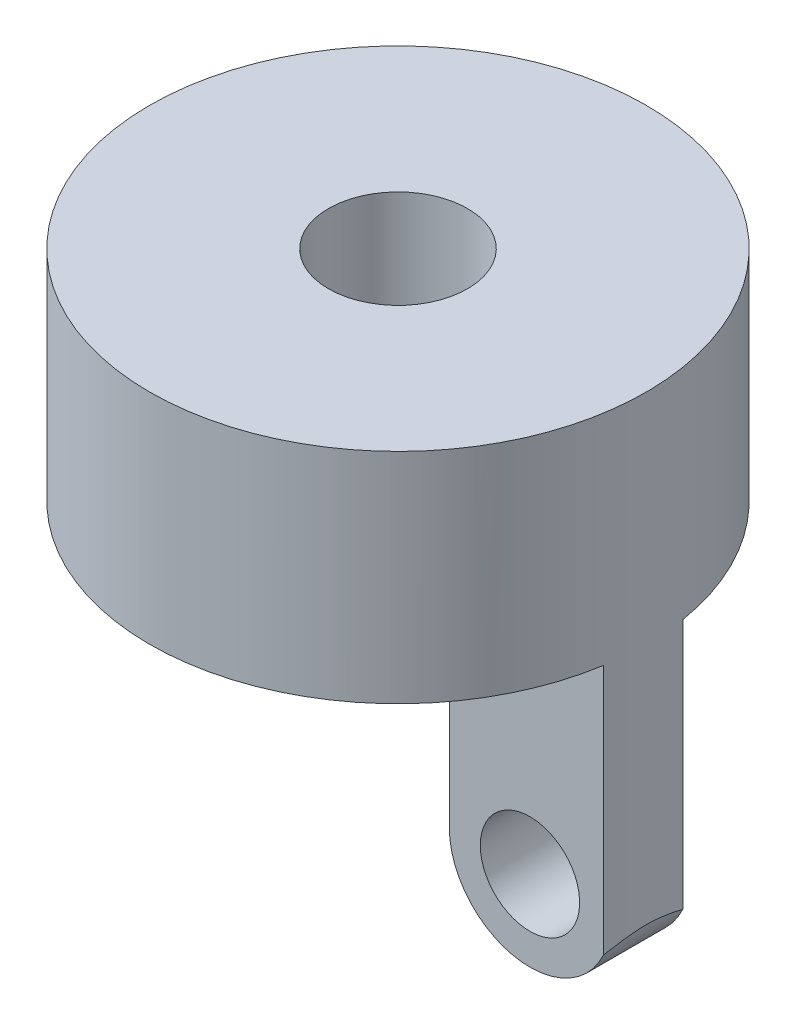
ISO-10303-21;
HEADER;
FILE_DESCRIPTION(('STEP AP214'),'2;1');
FILE_NAME('part.step','',(''),(''),'','','');
FILE_SCHEMA(('AUTOMOTIVE_DESIGN { 1 0 10303 214 1 1 1 1 }'));
ENDSEC;
DATA;
#1=APPLICATION_CONTEXT('core data for automotive mechanical design processes');
#2=APPLICATION_PROTOCOL_DEFINITION('international standard','automotive_design',2000,#1);
#3=PRODUCT_CONTEXT('',#1,'mechanical');
#4=PRODUCT('Part','Part','',(#3));
#5=PRODUCT_RELATED_PRODUCT_CATEGORY('part','',(#4));
#6=PRODUCT_DEFINITION_FORMATION('','',#4);
#7=PRODUCT_DEFINITION_CONTEXT('part definition',#1,'design');
#8=PRODUCT_DEFINITION('design','',#6,#7);
#9=PRODUCT_DEFINITION_SHAPE('','',#8);
#10=(LENGTH_UNIT() NAMED_UNIT(*) SI_UNIT(.MILLI.,.METRE.));
#11=(NAMED_UNIT(*) PLANE_ANGLE_UNIT() SI_UNIT($,.RADIAN.));
#12=(NAMED_UNIT(*) SI_UNIT($,.STERADIAN.) SOLID_ANGLE_UNIT());
#13=UNCERTAINTY_MEASURE_WITH_UNIT(LENGTH_MEASURE(1.E-05),#10,'distance_accuracy_value','');
#14=(GEOMETRIC_REPRESENTATION_CONTEXT(3) GLOBAL_UNCERTAINTY_ASSIGNED_CONTEXT((#13)) GLOBAL_UNIT_ASSIGNED_CONTEXT((#10,
#11,#12)) REPRESENTATION_CONTEXT('',''));
#15=CARTESIAN_POINT('',(0.,0.,0.));
#16=DIRECTION('',(0.,0.,1.));
#17=DIRECTION('',(1.,0.,0.));
#18=AXIS2_PLACEMENT_3D('',#15,#16,#17);
#19=CARTESIAN_POINT('',(3.55997152600054,-21.,2.));
#20=DIRECTION('',(0.,0.,-1.));
#21=DIRECTION('',(-1.,0.,0.));
#22=AXIS2_PLACEMENT_3D('',#19,#20,#21);
#23=PLANE('',#22);
#24=CARTESIAN_POINT('',(8.644378831569,-16.9381968633868,2.));
#25=DIRECTION('',(0.,0.,-1.));
#26=DIRECTION('',(-1.,0.,0.));
#27=AXIS2_PLACEMENT_3D('',#24,#25,#26);
#28=CIRCLE('',#27,2.5);
#29=CARTESIAN_POINT('',(6.144378831569,-16.9381968633868,2.));
#30=VERTEX_POINT('',#29);
#31=EDGE_CURVE('E321',#30,#30,#28,.F.);
#32=ORIENTED_EDGE('',*,*,#31,.F.);
#33=EDGE_LOOP('',(#32));
#34=FACE_BOUND('',#33,.T.);
#35=DIRECTION('',(0.,1.,0.));
#36=VECTOR('',#35,1.);
#37=CARTESIAN_POINT('',(4.58257569495584,-57.5614397968482,2.));
#38=LINE('',#37,#36);
#39=CARTESIAN_POINT('',(4.58257569495584,-16.9381968633868,2.));
#40=VERTEX_POINT('',#39);
#41=CARTESIAN_POINT('',(4.58257569495584,-6.,2.));
#42=VERTEX_POINT('',#41);
#43=EDGE_CURVE('E177',#40,#42,#38,.T.);
#44=ORIENTED_EDGE('',*,*,#43,.F.);
#45=CARTESIAN_POINT('',(8.644378831569,-16.9381968633868,2.));
#46=DIRECTION('',(0.,0.,-1.));
#47=DIRECTION('',(-1.,0.,0.));
#48=AXIS2_PLACEMENT_3D('',#45,#46,#47);
#49=CIRCLE('',#48,4.06180313661316);
#50=CARTESIAN_POINT('',(12.3389626792531,-18.625886086269,2.));
#51=VERTEX_POINT('',#50);
#52=EDGE_CURVE('E166',#40,#51,#49,.F.);
#53=ORIENTED_EDGE('',*,*,#52,.T.);
#54=DIRECTION('',(0.,1.,0.));
#55=VECTOR('',#54,1.);
#56=CARTESIAN_POINT('',(12.3389626792531,-57.5614397968482,2.));
#57=LINE('',#56,#55);
#58=CARTESIAN_POINT('',(12.3389626792531,-6.,2.));
#59=VERTEX_POINT('',#58);
#60=EDGE_CURVE('E188',#51,#59,#57,.T.);
#61=ORIENTED_EDGE('',*,*,#60,.T.);
#62=DIRECTION('',(-1.,0.,0.));
#63=VECTOR('',#62,1.);
#64=CARTESIAN_POINT('',(3.55997152600054,-6.,2.));
#65=LINE('',#64,#63);
#66=EDGE_CURVE('E182',#59,#42,#65,.T.);
#67=ORIENTED_EDGE('',*,*,#66,.T.);
#68=EDGE_LOOP('',(#44,#53,#61,#67));
#69=FACE_BOUND('',#68,.T.);
#70=ADVANCED_FACE('F120',(#34,#69),#23,.F.);
#71=CARTESIAN_POINT('',(3.55997152600054,-21.,-2.));
#72=DIRECTION('',(0.,0.,1.));
#73=DIRECTION('',(1.,0.,0.));
#74=AXIS2_PLACEMENT_3D('',#71,#72,#73);
#75=PLANE('',#74);
#76=CARTESIAN_POINT('',(8.644378831569,-16.9381968633868,-2.));
#77=DIRECTION('',(0.,0.,1.));
#78=DIRECTION('',(1.,0.,0.));
#79=AXIS2_PLACEMENT_3D('',#76,#77,#78);
#80=CIRCLE('',#79,2.5);
#81=CARTESIAN_POINT('',(11.144378831569,-16.9381968633868,-2.));
#82=VERTEX_POINT('',#81);
#83=EDGE_CURVE('E172',#82,#82,#80,.T.);
#84=ORIENTED_EDGE('',*,*,#83,.T.);
#85=EDGE_LOOP('',(#84));
#86=FACE_BOUND('',#85,.T.);
#87=CARTESIAN_POINT('',(8.644378831569,-16.9381968633868,-2.));
#88=DIRECTION('',(0.,0.,1.));
#89=DIRECTION('',(1.,0.,0.));
#90=AXIS2_PLACEMENT_3D('',#87,#88,#89);
#91=CIRCLE('',#90,4.06180313661316);
#92=CARTESIAN_POINT('',(4.58257569495584,-16.9381968633868,-2.));
#93=VERTEX_POINT('',#92);
#94=CARTESIAN_POINT('',(12.3389626792531,-18.625886086269,-2.));
#95=VERTEX_POINT('',#94);
#96=EDGE_CURVE('E141',#93,#95,#91,.T.);
#97=ORIENTED_EDGE('',*,*,#96,.F.);
#98=DIRECTION('',(0.,1.,0.));
#99=VECTOR('',#98,1.);
#100=CARTESIAN_POINT('',(4.58257569495584,-57.5614397968482,-2.));
#101=LINE('',#100,#99);
#102=CARTESIAN_POINT('',(4.58257569495584,-6.,-2.));
#103=VERTEX_POINT('',#102);
#104=EDGE_CURVE('E179',#103,#93,#101,.F.);
#105=ORIENTED_EDGE('',*,*,#104,.F.);
#106=DIRECTION('',(1.,0.,0.));
#107=VECTOR('',#106,1.);
#108=CARTESIAN_POINT('',(3.55997152600054,-6.,-2.));
#109=LINE('',#108,#107);
#110=CARTESIAN_POINT('',(12.3389626792531,-6.,-2.));
#111=VERTEX_POINT('',#110);
#112=EDGE_CURVE('E193',#103,#111,#109,.T.);
#113=ORIENTED_EDGE('',*,*,#112,.T.);
#114=DIRECTION('',(0.,1.,0.));
#115=VECTOR('',#114,1.);
#116=CARTESIAN_POINT('',(12.3389626792531,-57.5614397968482,-2.));
#117=LINE('',#116,#115);
#118=EDGE_CURVE('E148',#111,#95,#117,.F.);
#119=ORIENTED_EDGE('',*,*,#118,.T.);
#120=EDGE_LOOP('',(#97,#105,#113,#119));
#121=FACE_BOUND('',#120,.T.);
#122=ADVANCED_FACE('F219',(#86,#121),#75,.F.);
#123=CARTESIAN_POINT('',(0.,-6.,0.));
#124=DIRECTION('',(0.,1.,0.));
#125=DIRECTION('',(0.,0.,1.));
#126=AXIS2_PLACEMENT_3D('',#123,#124,#125);
#127=CYLINDRICAL_SURFACE('',#126,5.);
#128=CARTESIAN_POINT('',(0.,0.,0.));
#129=DIRECTION('',(0.,-1.,0.));
#130=DIRECTION('',(0.,0.,-1.));
#131=AXIS2_PLACEMENT_3D('',#128,#129,#130);
#132=CIRCLE('',#131,5.);
#133=CARTESIAN_POINT('',(0.,0.,-5.));
#134=VERTEX_POINT('',#133);
#135=EDGE_CURVE('E183',#134,#134,#132,.T.);
#136=ORIENTED_EDGE('',*,*,#135,.F.);
#137=EDGE_LOOP('',(#136));
#138=FACE_BOUND('',#137,.T.);
#139=ORIENTED_EDGE('',*,*,#104,.T.);
#140=CARTESIAN_POINT('',(4.58257569495584,-16.9381968633868,-2.));
#141=CARTESIAN_POINT('',(4.58257166257562,-16.9850329798573,-1.99999921680121));
#142=CARTESIAN_POINT('',(4.58338676064771,-17.0318456245396,-1.99814267953384));
#143=CARTESIAN_POINT('',(4.58661107049218,-17.1251148040744,-1.990734328326));
#144=CARTESIAN_POINT('',(4.58902002559892,-17.1715713950455,-1.98518310935514));
#145=CARTESIAN_POINT('',(4.5985498772572,-17.3096473564476,-1.96306194557036));
#146=CARTESIAN_POINT('',(4.60797437743193,-17.4003006938919,-1.94102418048763));
#147=CARTESIAN_POINT('',(4.63201105131777,-17.5762041193674,-1.88293571413865));
#148=CARTESIAN_POINT('',(4.64662336368701,-17.6614540629067,-1.84688463832681));
#149=CARTESIAN_POINT('',(4.67955880908503,-17.8244024449685,-1.76176137887855));
#150=CARTESIAN_POINT('',(4.6978825121511,-17.9020997207506,-1.71268719464644));
#151=CARTESIAN_POINT('',(4.73681741917494,-18.0495671058292,-1.60189240131234));
#152=CARTESIAN_POINT('',(4.75746472402998,-18.1191636119277,-1.53995426945075));
#153=CARTESIAN_POINT('',(4.79881984364669,-18.2475792309898,-1.40579270869435));
#154=CARTESIAN_POINT('',(4.81952767780948,-18.3063943852554,-1.33356551909201));
#155=CARTESIAN_POINT('',(4.86075357235941,-18.4167670628698,-1.17485831296728));
#156=CARTESIAN_POINT('',(4.88113291421721,-18.467410621604,-1.08770784659037));
#157=CARTESIAN_POINT('',(4.91807218295739,-18.5553431065092,-0.906177674989677));
#158=CARTESIAN_POINT('',(4.93463061213128,-18.59262679908,-0.81179515421358));
#159=CARTESIAN_POINT('',(4.96403048646288,-18.6571133020144,-0.608276614973156));
#160=CARTESIAN_POINT('',(4.97632439339905,-18.6829096066249,-0.498615266854121));
#161=CARTESIAN_POINT('',(4.99361520168061,-18.7188041006163,-0.276177924902195));
#162=CARTESIAN_POINT('',(4.99860849817959,-18.7288945350168,-0.16340042037796));
#163=CARTESIAN_POINT('',(5.00097319260682,-18.7337081161931,0.0715150473404747));
#164=CARTESIAN_POINT('',(4.99771078430185,-18.7271532381459,0.193688125979685));
#165=CARTESIAN_POINT('',(4.9824972596549,-18.6957995745804,0.435157961717974));
#166=CARTESIAN_POINT('',(4.97054429781923,-18.6709969140174,0.554454102320976));
#167=CARTESIAN_POINT('',(4.93900515784182,-18.6024933950145,0.787496063142617));
#168=CARTESIAN_POINT('',(4.91936141172844,-18.5586497315923,0.901192567209002));
#169=CARTESIAN_POINT('',(4.87465641745739,-18.451727677962,1.11801885574038));
#170=CARTESIAN_POINT('',(4.84959805743846,-18.3886595346966,1.22115423042029));
#171=CARTESIAN_POINT('',(4.7992913839599,-18.249152184241,1.40543741147258));
#172=CARTESIAN_POINT('',(4.77419901363915,-18.1740748603146,1.48765537077055));
#173=CARTESIAN_POINT('',(4.72536596060077,-18.0091470347261,1.63616685132986));
#174=CARTESIAN_POINT('',(4.70162433028084,-17.9193070661211,1.70247164414057));
#175=CARTESIAN_POINT('',(4.66110551462091,-17.7378652595613,1.81026631520501));
#176=CARTESIAN_POINT('',(4.64385354846873,-17.6474963527111,1.85366021865943));
#177=CARTESIAN_POINT('',(4.61509293355906,-17.459795984094,1.92415793426063));
#178=CARTESIAN_POINT('',(4.6035769949504,-17.3624735403909,1.95128243201079));
#179=CARTESIAN_POINT('',(4.59131183353604,-17.2098521725657,1.97989046776812));
#180=CARTESIAN_POINT('',(4.58804670278028,-17.155813461638,1.98742926883273));
#181=CARTESIAN_POINT('',(4.58367580306316,-17.0472591742675,1.99748055750272));
#182=CARTESIAN_POINT('',(4.5825670807546,-16.9927443528899,1.99999991968462));
#183=CARTESIAN_POINT('',(4.58257569495584,-16.9381968633868,2.));
#184=B_SPLINE_CURVE_WITH_KNOTS('',3,(#140,#141,#142,#143,#144,#145,#146,#147,#148,#149,#150,
#151,#152,#153,#154,#155,#156,#157,#158,#159,#160,#161,#162,#163,#164,#165,#166,#167,#168,#169,
#170,#171,#172,#173,#174,#175,#176,#177,#178,#179,#180,#181,#182,#183),.UNSPECIFIED.,.F.,.F.,(4,
2,2,2,2,2,2,2,2,2,2,2,2,2,2,2,2,2,2,2,2,4),(0.,0.14041822554811,0.280813844448237,
0.560634824968137,0.840463285013923,1.1203347569113,1.40539314314852,1.69055598841388,
1.9977882856126,2.30514080689584,2.64367550717243,2.98237731045355,3.34785721712085,
3.71341475842224,4.08176260256,4.44991445394599,4.79038569341411,5.13061505519165,
5.43418402621946,5.73736620424777,5.90109987653904,6.06460914614694),.UNSPECIFIED.);
#185=EDGE_CURVE('E13',#93,#40,#184,.T.);
#186=ORIENTED_EDGE('',*,*,#185,.T.);
#187=ORIENTED_EDGE('',*,*,#43,.T.);
#188=CARTESIAN_POINT('',(0.,-6.,0.));
#189=DIRECTION('',(0.,-1.,0.));
#190=DIRECTION('',(0.,0.,-1.));
#191=AXIS2_PLACEMENT_3D('',#188,#189,#190);
#192=CIRCLE('',#191,5.);
#193=EDGE_CURVE('E186',#42,#103,#192,.T.);
#194=ORIENTED_EDGE('',*,*,#193,.T.);
#195=EDGE_LOOP('',(#139,#186,#187,#194));
#196=FACE_BOUND('',#195,.T.);
#197=ADVANCED_FACE('F175',(#138,#196),#127,.F.);
#198=CARTESIAN_POINT('',(0.,5.,0.));
#199=DIRECTION('',(0.,-1.,0.));
#200=DIRECTION('',(0.,0.,-1.));
#201=AXIS2_PLACEMENT_3D('',#198,#199,#200);
#202=CYLINDRICAL_SURFACE('',#201,12.5);
#203=CARTESIAN_POINT('',(0.,5.,0.));
#204=DIRECTION('',(0.,1.,0.));
#205=DIRECTION('',(0.,0.,1.));
#206=AXIS2_PLACEMENT_3D('',#203,#204,#205);
#207=CIRCLE('',#206,12.5);
#208=CARTESIAN_POINT('',(0.,5.,12.5));
#209=VERTEX_POINT('',#208);
#210=EDGE_CURVE('E194',#209,#209,#207,.T.);
#211=ORIENTED_EDGE('',*,*,#210,.F.);
#212=EDGE_LOOP('',(#211));
#213=FACE_BOUND('',#212,.T.);
#214=CARTESIAN_POINT('',(12.3389626792531,-18.625886086269,-2.));
#215=CARTESIAN_POINT('',(12.3523448189668,-18.5965991366166,-1.91742889208521));
#216=CARTESIAN_POINT('',(12.3649443549721,-18.5680854222741,-1.83445874496332));
#217=CARTESIAN_POINT('',(12.3885563324381,-18.5130845034578,-1.66756977249111));
#218=CARTESIAN_POINT('',(12.3995677818008,-18.48659857057,-1.58365038913599));
#219=CARTESIAN_POINT('',(12.430322567455,-18.4105640308486,-1.32908099546887));
#220=CARTESIAN_POINT('',(12.4475764630174,-18.3649113935891,-1.15690458386984));
#221=CARTESIAN_POINT('',(12.4744128505054,-18.2911862811192,-0.81654893114692));
#222=CARTESIAN_POINT('',(12.4843156711685,-18.2623930282988,-0.64855792829204));
#223=CARTESIAN_POINT('',(12.4972748150696,-18.2242308980728,-0.310680208987152));
#224=CARTESIAN_POINT('',(12.5003594774694,-18.2147816309957,-0.14080430006586));
#225=CARTESIAN_POINT('',(12.4995839803813,-18.2171145938849,0.194166193126393));
#226=CARTESIAN_POINT('',(12.4959096270701,-18.2283287967748,0.359265679573408));
#227=CARTESIAN_POINT('',(12.4821650609757,-18.2686340113059,0.687532157241193));
#228=CARTESIAN_POINT('',(12.4720691965133,-18.2977967056627,0.850688711909434));
#229=CARTESIAN_POINT('',(12.4452292125575,-18.3711488740499,1.18113379177422));
#230=CARTESIAN_POINT('',(12.4281909597734,-18.4159887342894,1.34824821858898));
#231=CARTESIAN_POINT('',(12.3980385687644,-18.4902914052832,1.59544998193344));
#232=CARTESIAN_POINT('',(12.3872712715924,-18.5161218452339,1.67697008600172));
#233=CARTESIAN_POINT('',(12.3642361091008,-18.5696870234866,1.83911899109374));
#234=CARTESIAN_POINT('',(12.351969084112,-18.5974206915805,1.9197482639029));
#235=CARTESIAN_POINT('',(12.3389626792531,-18.625886086269,2.));
#236=B_SPLINE_CURVE_WITH_KNOTS('',3,(#214,#215,#216,#217,#218,#219,#220,#221,#222,#223,#224,
#225,#226,#227,#228,#229,#230,#231,#232,#233,#234,#235),.UNSPECIFIED.,.F.,.F.,(4,2,2,2,2,2,2,2,
2,2,4),(0.,0.265863562011158,0.531892499573819,1.0680976704154,1.57928833277778,
2.08835024226051,2.5836265701495,3.08089388577996,3.60187932562448,3.86042159532495,
4.11881965634474),.UNSPECIFIED.);
#237=EDGE_CURVE('E134',#95,#51,#236,.T.);
#238=ORIENTED_EDGE('',*,*,#237,.F.);
#239=ORIENTED_EDGE('',*,*,#118,.F.);
#240=CARTESIAN_POINT('',(0.,-6.,0.));
#241=DIRECTION('',(0.,-1.,0.));
#242=DIRECTION('',(0.,0.,-1.));
#243=AXIS2_PLACEMENT_3D('',#240,#241,#242);
#244=CIRCLE('',#243,12.5);
#245=EDGE_CURVE('E197',#59,#111,#244,.T.);
#246=ORIENTED_EDGE('',*,*,#245,.F.);
#247=ORIENTED_EDGE('',*,*,#60,.F.);
#248=EDGE_LOOP('',(#238,#239,#246,#247));
#249=FACE_BOUND('',#248,.T.);
#250=ADVANCED_FACE('F122',(#213,#249),#202,.T.);
#251=CARTESIAN_POINT('',(0.,5.,0.));
#252=DIRECTION('',(0.,1.,0.));
#253=DIRECTION('',(0.,0.,1.));
#254=AXIS2_PLACEMENT_3D('',#251,#252,#253);
#255=PLANE('',#254);
#256=ORIENTED_EDGE('',*,*,#210,.T.);
#257=EDGE_LOOP('',(#256));
#258=FACE_BOUND('',#257,.T.);
#259=CARTESIAN_POINT('',(0.,5.,0.));
#260=DIRECTION('',(0.,1.,0.));
#261=DIRECTION('',(0.,0.,1.));
#262=AXIS2_PLACEMENT_3D('',#259,#260,#261);
#263=CIRCLE('',#262,3.5);
#264=CARTESIAN_POINT('',(0.,5.,3.5));
#265=VERTEX_POINT('',#264);
#266=EDGE_CURVE('E201',#265,#265,#263,.T.);
#267=ORIENTED_EDGE('',*,*,#266,.F.);
#268=EDGE_LOOP('',(#267));
#269=FACE_BOUND('',#268,.T.);
#270=ADVANCED_FACE('F237',(#258,#269),#255,.T.);
#271=CARTESIAN_POINT('',(0.,0.,0.));
#272=DIRECTION('',(0.,1.,0.));
#273=DIRECTION('',(0.,0.,1.));
#274=AXIS2_PLACEMENT_3D('',#271,#272,#273);
#275=PLANE('',#274);
#276=ORIENTED_EDGE('',*,*,#135,.T.);
#277=EDGE_LOOP('',(#276));
#278=FACE_BOUND('',#277,.T.);
#279=CARTESIAN_POINT('',(0.,0.,0.));
#280=DIRECTION('',(0.,1.,0.));
#281=DIRECTION('',(0.,0.,1.));
#282=AXIS2_PLACEMENT_3D('',#279,#280,#281);
#283=CIRCLE('',#282,3.5);
#284=CARTESIAN_POINT('',(0.,0.,3.5));
#285=VERTEX_POINT('',#284);
#286=EDGE_CURVE('E200',#285,#285,#283,.T.);
#287=ORIENTED_EDGE('',*,*,#286,.T.);
#288=EDGE_LOOP('',(#287));
#289=FACE_BOUND('',#288,.T.);
#290=ADVANCED_FACE('F235',(#278,#289),#275,.F.);
#291=CARTESIAN_POINT('',(0.,5.,0.));
#292=DIRECTION('',(0.,-1.,0.));
#293=DIRECTION('',(0.,0.,-1.));
#294=AXIS2_PLACEMENT_3D('',#291,#292,#293);
#295=CYLINDRICAL_SURFACE('',#294,3.5);
#296=ORIENTED_EDGE('',*,*,#266,.T.);
#297=EDGE_LOOP('',(#296));
#298=FACE_BOUND('',#297,.T.);
#299=ORIENTED_EDGE('',*,*,#286,.F.);
#300=EDGE_LOOP('',(#299));
#301=FACE_BOUND('',#300,.T.);
#302=ADVANCED_FACE('F231',(#298,#301),#295,.F.);
#303=CARTESIAN_POINT('',(0.,-6.,0.));
#304=DIRECTION('',(0.,-1.,0.));
#305=DIRECTION('',(0.,0.,-1.));
#306=AXIS2_PLACEMENT_3D('',#303,#304,#305);
#307=PLANE('',#306);
#308=ORIENTED_EDGE('',*,*,#112,.F.);
#309=ORIENTED_EDGE('',*,*,#193,.F.);
#310=ORIENTED_EDGE('',*,*,#66,.F.);
#311=ORIENTED_EDGE('',*,*,#245,.T.);
#312=EDGE_LOOP('',(#308,#309,#310,#311));
#313=FACE_BOUND('',#312,.T.);
#314=ADVANCED_FACE('F217',(#313),#307,.T.);
#315=CARTESIAN_POINT('',(8.644378831569,-16.9381968633868,9.07106781186547));
#316=DIRECTION('',(0.,0.,-1.));
#317=DIRECTION('',(-1.,0.,0.));
#318=AXIS2_PLACEMENT_3D('',#315,#316,#317);
#319=CYLINDRICAL_SURFACE('',#318,2.5);
#320=ORIENTED_EDGE('',*,*,#31,.T.);
#321=EDGE_LOOP('',(#320));
#322=FACE_BOUND('',#321,.T.);
#323=ORIENTED_EDGE('',*,*,#83,.F.);
#324=EDGE_LOOP('',(#323));
#325=FACE_BOUND('',#324,.T.);
#326=ADVANCED_FACE('F213',(#322,#325),#319,.F.);
#327=CARTESIAN_POINT('',(8.644378831569,-16.9381968633868,9.07106781186547));
#328=DIRECTION('',(0.,0.,-1.));
#329=DIRECTION('',(-1.,0.,0.));
#330=AXIS2_PLACEMENT_3D('',#327,#328,#329);
#331=CYLINDRICAL_SURFACE('',#330,4.06180313661316);
#332=ORIENTED_EDGE('',*,*,#237,.T.);
#333=ORIENTED_EDGE('',*,*,#52,.F.);
#334=ORIENTED_EDGE('',*,*,#185,.F.);
#335=ORIENTED_EDGE('',*,*,#96,.T.);
#336=EDGE_LOOP('',(#332,#333,#334,#335));
#337=FACE_BOUND('',#336,.T.);
#338=ADVANCED_FACE('F167',(#337),#331,.T.);
#339=CLOSED_SHELL('',(#70,#122,#197,#250,#270,#290,#302,#314,#326,#338));
#340=MANIFOLD_SOLID_BREP('B2',#339);
#341=ADVANCED_BREP_SHAPE_REPRESENTATION('',(#18,#340),#14);
#342=SHAPE_DEFINITION_REPRESENTATION(#9,#341);
ENDSEC;
END-ISO-10303-21;
